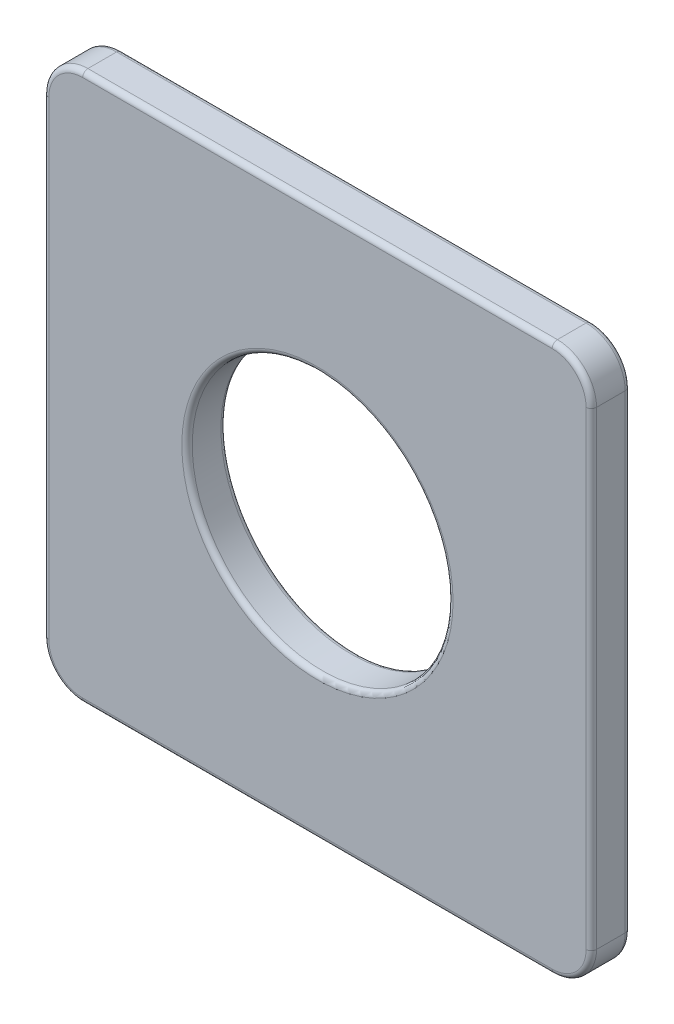
ISO-10303-21;
HEADER;
FILE_DESCRIPTION(('STEP AP214'),'2;1');
FILE_NAME('part.step','',(''),(''),'','','');
FILE_SCHEMA(('AUTOMOTIVE_DESIGN { 1 0 10303 214 1 1 1 1 }'));
ENDSEC;
DATA;
#1=APPLICATION_CONTEXT('core data for automotive mechanical design processes');
#2=APPLICATION_PROTOCOL_DEFINITION('international standard','automotive_design',2000,#1);
#3=PRODUCT_CONTEXT('',#1,'mechanical');
#4=PRODUCT('Part','Part','',(#3));
#5=PRODUCT_RELATED_PRODUCT_CATEGORY('part','',(#4));
#6=PRODUCT_DEFINITION_FORMATION('','',#4);
#7=PRODUCT_DEFINITION_CONTEXT('part definition',#1,'design');
#8=PRODUCT_DEFINITION('design','',#6,#7);
#9=PRODUCT_DEFINITION_SHAPE('','',#8);
#10=(LENGTH_UNIT() NAMED_UNIT(*) SI_UNIT(.MILLI.,.METRE.));
#11=(NAMED_UNIT(*) PLANE_ANGLE_UNIT() SI_UNIT($,.RADIAN.));
#12=(NAMED_UNIT(*) SI_UNIT($,.STERADIAN.) SOLID_ANGLE_UNIT());
#13=UNCERTAINTY_MEASURE_WITH_UNIT(LENGTH_MEASURE(1.E-05),#10,'distance_accuracy_value','');
#14=(GEOMETRIC_REPRESENTATION_CONTEXT(3) GLOBAL_UNCERTAINTY_ASSIGNED_CONTEXT((#13)) GLOBAL_UNIT_ASSIGNED_CONTEXT((#10,
#11,#12)) REPRESENTATION_CONTEXT('',''));
#15=CARTESIAN_POINT('',(0.,0.,0.));
#16=DIRECTION('',(0.,0.,1.));
#17=DIRECTION('',(1.,0.,0.));
#18=AXIS2_PLACEMENT_3D('',#15,#16,#17);
#19=CARTESIAN_POINT('',(-10.5,-10.5,0.75));
#20=DIRECTION('',(1.,0.,0.));
#21=DIRECTION('',(0.,0.,-1.));
#22=AXIS2_PLACEMENT_3D('',#19,#20,#21);
#23=PLANE('',#22);
#24=DIRECTION('',(0.,0.,-1.));
#25=VECTOR('',#24,1.);
#26=CARTESIAN_POINT('',(-10.5,-9.,0.75));
#27=LINE('',#26,#25);
#28=CARTESIAN_POINT('',(-10.5,-9.,-0.55));
#29=VERTEX_POINT('',#28);
#30=CARTESIAN_POINT('',(-10.5,-9.,0.55));
#31=VERTEX_POINT('',#30);
#32=EDGE_CURVE('E252',#29,#31,#27,.F.);
#33=ORIENTED_EDGE('',*,*,#32,.T.);
#34=DIRECTION('',(0.,-1.,0.));
#35=VECTOR('',#34,1.);
#36=CARTESIAN_POINT('',(-10.5,8.99999999999999,0.55));
#37=LINE('',#36,#35);
#38=CARTESIAN_POINT('',(-10.5,9.,0.55));
#39=VERTEX_POINT('',#38);
#40=EDGE_CURVE('E204',#31,#39,#37,.F.);
#41=ORIENTED_EDGE('',*,*,#40,.T.);
#42=DIRECTION('',(0.,0.,-1.));
#43=VECTOR('',#42,1.);
#44=CARTESIAN_POINT('',(-10.5,9.,0.75));
#45=LINE('',#44,#43);
#46=CARTESIAN_POINT('',(-10.5,9.,-0.55));
#47=VERTEX_POINT('',#46);
#48=EDGE_CURVE('E298',#39,#47,#45,.T.);
#49=ORIENTED_EDGE('',*,*,#48,.T.);
#50=DIRECTION('',(0.,-1.,0.));
#51=VECTOR('',#50,1.);
#52=CARTESIAN_POINT('',(-10.5,-10.5,-0.55));
#53=LINE('',#52,#51);
#54=EDGE_CURVE('E202',#47,#29,#53,.T.);
#55=ORIENTED_EDGE('',*,*,#54,.T.);
#56=EDGE_LOOP('',(#33,#41,#49,#55));
#57=FACE_BOUND('',#56,.T.);
#58=ADVANCED_FACE('F37',(#57),#23,.F.);
#59=CARTESIAN_POINT('',(10.5,-10.5,0.75));
#60=DIRECTION('',(0.,1.,0.));
#61=DIRECTION('',(-1.,0.,0.));
#62=AXIS2_PLACEMENT_3D('',#59,#60,#61);
#63=PLANE('',#62);
#64=DIRECTION('',(0.,0.,-1.));
#65=VECTOR('',#64,1.);
#66=CARTESIAN_POINT('',(9.,-10.5,0.75));
#67=LINE('',#66,#65);
#68=CARTESIAN_POINT('',(9.,-10.5,-0.55));
#69=VERTEX_POINT('',#68);
#70=CARTESIAN_POINT('',(9.,-10.5,0.55));
#71=VERTEX_POINT('',#70);
#72=EDGE_CURVE('E312',#69,#71,#67,.F.);
#73=ORIENTED_EDGE('',*,*,#72,.T.);
#74=DIRECTION('',(1.,0.,0.));
#75=VECTOR('',#74,1.);
#76=CARTESIAN_POINT('',(-9.,-10.5,0.55));
#77=LINE('',#76,#75);
#78=CARTESIAN_POINT('',(-9.,-10.5,0.55));
#79=VERTEX_POINT('',#78);
#80=EDGE_CURVE('E195',#71,#79,#77,.F.);
#81=ORIENTED_EDGE('',*,*,#80,.T.);
#82=DIRECTION('',(0.,0.,-1.));
#83=VECTOR('',#82,1.);
#84=CARTESIAN_POINT('',(-9.,-10.5,0.75));
#85=LINE('',#84,#83);
#86=CARTESIAN_POINT('',(-9.,-10.5,-0.55));
#87=VERTEX_POINT('',#86);
#88=EDGE_CURVE('E309',#79,#87,#85,.T.);
#89=ORIENTED_EDGE('',*,*,#88,.T.);
#90=DIRECTION('',(1.,0.,0.));
#91=VECTOR('',#90,1.);
#92=CARTESIAN_POINT('',(10.5,-10.5,-0.55));
#93=LINE('',#92,#91);
#94=EDGE_CURVE('E193',#87,#69,#93,.T.);
#95=ORIENTED_EDGE('',*,*,#94,.T.);
#96=EDGE_LOOP('',(#73,#81,#89,#95));
#97=FACE_BOUND('',#96,.T.);
#98=ADVANCED_FACE('F380',(#97),#63,.F.);
#99=CARTESIAN_POINT('',(10.5,-10.5,0.75));
#100=DIRECTION('',(-1.,0.,0.));
#101=DIRECTION('',(0.,0.,1.));
#102=AXIS2_PLACEMENT_3D('',#99,#100,#101);
#103=PLANE('',#102);
#104=DIRECTION('',(0.,0.,-1.));
#105=VECTOR('',#104,1.);
#106=CARTESIAN_POINT('',(10.5,9.00000000000001,0.75));
#107=LINE('',#106,#105);
#108=CARTESIAN_POINT('',(10.5,9.00000000000001,-0.55));
#109=VERTEX_POINT('',#108);
#110=CARTESIAN_POINT('',(10.5,9.00000000000001,0.55));
#111=VERTEX_POINT('',#110);
#112=EDGE_CURVE('E292',#109,#111,#107,.F.);
#113=ORIENTED_EDGE('',*,*,#112,.T.);
#114=DIRECTION('',(0.,1.,0.));
#115=VECTOR('',#114,1.);
#116=CARTESIAN_POINT('',(10.5,-9.,0.55));
#117=LINE('',#116,#115);
#118=CARTESIAN_POINT('',(10.5,-9.,0.55));
#119=VERTEX_POINT('',#118);
#120=EDGE_CURVE('E187',#111,#119,#117,.F.);
#121=ORIENTED_EDGE('',*,*,#120,.T.);
#122=DIRECTION('',(0.,0.,-1.));
#123=VECTOR('',#122,1.);
#124=CARTESIAN_POINT('',(10.5,-9.,0.75));
#125=LINE('',#124,#123);
#126=CARTESIAN_POINT('',(10.5,-9.,-0.55));
#127=VERTEX_POINT('',#126);
#128=EDGE_CURVE('E306',#119,#127,#125,.T.);
#129=ORIENTED_EDGE('',*,*,#128,.T.);
#130=DIRECTION('',(0.,1.,0.));
#131=VECTOR('',#130,1.);
#132=CARTESIAN_POINT('',(10.5,-10.5,-0.55));
#133=LINE('',#132,#131);
#134=EDGE_CURVE('E185',#127,#109,#133,.T.);
#135=ORIENTED_EDGE('',*,*,#134,.T.);
#136=EDGE_LOOP('',(#113,#121,#129,#135));
#137=FACE_BOUND('',#136,.T.);
#138=ADVANCED_FACE('F335',(#137),#103,.F.);
#139=CARTESIAN_POINT('',(10.5,10.5,0.75));
#140=DIRECTION('',(0.,-1.,0.));
#141=DIRECTION('',(1.,0.,0.));
#142=AXIS2_PLACEMENT_3D('',#139,#140,#141);
#143=PLANE('',#142);
#144=DIRECTION('',(0.,0.,-1.));
#145=VECTOR('',#144,1.);
#146=CARTESIAN_POINT('',(-9.,10.5,0.75));
#147=LINE('',#146,#145);
#148=CARTESIAN_POINT('',(-9.,10.5,-0.55));
#149=VERTEX_POINT('',#148);
#150=CARTESIAN_POINT('',(-9.,10.5,0.55));
#151=VERTEX_POINT('',#150);
#152=EDGE_CURVE('E297',#149,#151,#147,.F.);
#153=ORIENTED_EDGE('',*,*,#152,.T.);
#154=DIRECTION('',(-1.,0.,0.));
#155=VECTOR('',#154,1.);
#156=CARTESIAN_POINT('',(9.,10.5,0.55));
#157=LINE('',#156,#155);
#158=CARTESIAN_POINT('',(9.,10.5,0.55));
#159=VERTEX_POINT('',#158);
#160=EDGE_CURVE('E212',#151,#159,#157,.F.);
#161=ORIENTED_EDGE('',*,*,#160,.T.);
#162=DIRECTION('',(0.,0.,-1.));
#163=VECTOR('',#162,1.);
#164=CARTESIAN_POINT('',(9.,10.5,0.75));
#165=LINE('',#164,#163);
#166=CARTESIAN_POINT('',(9.,10.5,-0.55));
#167=VERTEX_POINT('',#166);
#168=EDGE_CURVE('E290',#159,#167,#165,.T.);
#169=ORIENTED_EDGE('',*,*,#168,.T.);
#170=DIRECTION('',(-1.,0.,0.));
#171=VECTOR('',#170,1.);
#172=CARTESIAN_POINT('',(10.5,10.5,-0.55));
#173=LINE('',#172,#171);
#174=EDGE_CURVE('E210',#167,#149,#173,.T.);
#175=ORIENTED_EDGE('',*,*,#174,.T.);
#176=EDGE_LOOP('',(#153,#161,#169,#175));
#177=FACE_BOUND('',#176,.T.);
#178=ADVANCED_FACE('F295',(#177),#143,.F.);
#179=CARTESIAN_POINT('',(0.,0.,0.75));
#180=DIRECTION('',(0.,0.,1.));
#181=DIRECTION('',(1.,0.,0.));
#182=AXIS2_PLACEMENT_3D('',#179,#180,#181);
#183=PLANE('',#182);
#184=DIRECTION('',(0.,1.,0.));
#185=VECTOR('',#184,1.);
#186=CARTESIAN_POINT('',(10.3,9.,0.75));
#187=LINE('',#186,#185);
#188=CARTESIAN_POINT('',(10.3,-9.,0.75));
#189=VERTEX_POINT('',#188);
#190=CARTESIAN_POINT('',(10.3,9.00000000000001,0.75));
#191=VERTEX_POINT('',#190);
#192=EDGE_CURVE('E175',#189,#191,#187,.T.);
#193=ORIENTED_EDGE('',*,*,#192,.T.);
#194=CARTESIAN_POINT('',(9.,9.,0.75));
#195=DIRECTION('',(0.,0.,1.));
#196=DIRECTION('',(1.,0.,0.));
#197=AXIS2_PLACEMENT_3D('',#194,#195,#196);
#198=CIRCLE('',#197,1.3);
#199=CARTESIAN_POINT('',(9.,10.3,0.75));
#200=VERTEX_POINT('',#199);
#201=EDGE_CURVE('E155',#191,#200,#198,.T.);
#202=ORIENTED_EDGE('',*,*,#201,.T.);
#203=DIRECTION('',(-1.,0.,0.));
#204=VECTOR('',#203,1.);
#205=CARTESIAN_POINT('',(-9.,10.3,0.75));
#206=LINE('',#205,#204);
#207=CARTESIAN_POINT('',(-9.,10.3,0.75));
#208=VERTEX_POINT('',#207);
#209=EDGE_CURVE('E163',#200,#208,#206,.T.);
#210=ORIENTED_EDGE('',*,*,#209,.T.);
#211=CARTESIAN_POINT('',(-9.,9.,0.75));
#212=DIRECTION('',(0.,0.,1.));
#213=DIRECTION('',(1.,0.,0.));
#214=AXIS2_PLACEMENT_3D('',#211,#212,#213);
#215=CIRCLE('',#214,1.3);
#216=CARTESIAN_POINT('',(-10.3,9.,0.75));
#217=VERTEX_POINT('',#216);
#218=EDGE_CURVE('E169',#208,#217,#215,.T.);
#219=ORIENTED_EDGE('',*,*,#218,.T.);
#220=DIRECTION('',(0.,-1.,0.));
#221=VECTOR('',#220,1.);
#222=CARTESIAN_POINT('',(-10.3,-9.,0.75));
#223=LINE('',#222,#221);
#224=CARTESIAN_POINT('',(-10.3,-9.,0.75));
#225=VERTEX_POINT('',#224);
#226=EDGE_CURVE('E318',#217,#225,#223,.T.);
#227=ORIENTED_EDGE('',*,*,#226,.T.);
#228=CARTESIAN_POINT('',(-9.,-9.,0.75));
#229=DIRECTION('',(0.,0.,1.));
#230=DIRECTION('',(1.,0.,0.));
#231=AXIS2_PLACEMENT_3D('',#228,#229,#230);
#232=CIRCLE('',#231,1.3);
#233=CARTESIAN_POINT('',(-9.,-10.3,0.75));
#234=VERTEX_POINT('',#233);
#235=EDGE_CURVE('E320',#225,#234,#232,.T.);
#236=ORIENTED_EDGE('',*,*,#235,.T.);
#237=DIRECTION('',(1.,0.,0.));
#238=VECTOR('',#237,1.);
#239=CARTESIAN_POINT('',(9.,-10.3,0.75));
#240=LINE('',#239,#238);
#241=CARTESIAN_POINT('',(9.,-10.3,0.75));
#242=VERTEX_POINT('',#241);
#243=EDGE_CURVE('E322',#234,#242,#240,.T.);
#244=ORIENTED_EDGE('',*,*,#243,.T.);
#245=CARTESIAN_POINT('',(9.,-9.,0.75));
#246=DIRECTION('',(0.,0.,1.));
#247=DIRECTION('',(1.,0.,0.));
#248=AXIS2_PLACEMENT_3D('',#245,#246,#247);
#249=CIRCLE('',#248,1.3);
#250=EDGE_CURVE('E180',#242,#189,#249,.T.);
#251=ORIENTED_EDGE('',*,*,#250,.T.);
#252=EDGE_LOOP('',(#193,#202,#210,#219,#227,#236,#244,#251));
#253=FACE_BOUND('',#252,.T.);
#254=CARTESIAN_POINT('',(0.,0.,0.75));
#255=DIRECTION('',(0.,0.,1.));
#256=DIRECTION('',(1.,0.,0.));
#257=AXIS2_PLACEMENT_3D('',#254,#255,#256);
#258=CIRCLE('',#257,5.2);
#259=CARTESIAN_POINT('',(5.2,0.,0.75));
#260=VERTEX_POINT('',#259);
#261=EDGE_CURVE('E170',#260,#260,#258,.F.);
#262=ORIENTED_EDGE('',*,*,#261,.T.);
#263=EDGE_LOOP('',(#262));
#264=FACE_BOUND('',#263,.T.);
#265=ADVANCED_FACE('F172',(#253,#264),#183,.T.);
#266=CARTESIAN_POINT('',(0.,0.,-0.75));
#267=DIRECTION('',(0.,0.,1.));
#268=DIRECTION('',(1.,0.,0.));
#269=AXIS2_PLACEMENT_3D('',#266,#267,#268);
#270=PLANE('',#269);
#271=DIRECTION('',(1.,0.,0.));
#272=VECTOR('',#271,1.);
#273=CARTESIAN_POINT('',(0.,-10.3,-0.75));
#274=LINE('',#273,#272);
#275=CARTESIAN_POINT('',(9.,-10.3,-0.75));
#276=VERTEX_POINT('',#275);
#277=CARTESIAN_POINT('',(-9.,-10.3,-0.75));
#278=VERTEX_POINT('',#277);
#279=EDGE_CURVE('E46',#276,#278,#274,.F.);
#280=ORIENTED_EDGE('',*,*,#279,.T.);
#281=CARTESIAN_POINT('',(-9.,-9.,-0.75));
#282=DIRECTION('',(0.,0.,1.));
#283=DIRECTION('',(1.,0.,0.));
#284=AXIS2_PLACEMENT_3D('',#281,#282,#283);
#285=CIRCLE('',#284,1.3);
#286=CARTESIAN_POINT('',(-10.3,-9.,-0.75));
#287=VERTEX_POINT('',#286);
#288=EDGE_CURVE('E11',#278,#287,#285,.F.);
#289=ORIENTED_EDGE('',*,*,#288,.T.);
#290=DIRECTION('',(0.,-1.,0.));
#291=VECTOR('',#290,1.);
#292=CARTESIAN_POINT('',(-10.3,0.,-0.75));
#293=LINE('',#292,#291);
#294=CARTESIAN_POINT('',(-10.3,9.,-0.75));
#295=VERTEX_POINT('',#294);
#296=EDGE_CURVE('E223',#287,#295,#293,.F.);
#297=ORIENTED_EDGE('',*,*,#296,.T.);
#298=CARTESIAN_POINT('',(-9.,9.,-0.75));
#299=DIRECTION('',(0.,0.,1.));
#300=DIRECTION('',(1.,0.,0.));
#301=AXIS2_PLACEMENT_3D('',#298,#299,#300);
#302=CIRCLE('',#301,1.3);
#303=CARTESIAN_POINT('',(-9.,10.3,-0.75));
#304=VERTEX_POINT('',#303);
#305=EDGE_CURVE('E225',#295,#304,#302,.F.);
#306=ORIENTED_EDGE('',*,*,#305,.T.);
#307=DIRECTION('',(-1.,0.,0.));
#308=VECTOR('',#307,1.);
#309=CARTESIAN_POINT('',(0.,10.3,-0.75));
#310=LINE('',#309,#308);
#311=CARTESIAN_POINT('',(9.,10.3,-0.75));
#312=VERTEX_POINT('',#311);
#313=EDGE_CURVE('E227',#304,#312,#310,.F.);
#314=ORIENTED_EDGE('',*,*,#313,.T.);
#315=CARTESIAN_POINT('',(9.,9.,-0.75));
#316=DIRECTION('',(0.,0.,1.));
#317=DIRECTION('',(1.,0.,0.));
#318=AXIS2_PLACEMENT_3D('',#315,#316,#317);
#319=CIRCLE('',#318,1.3);
#320=CARTESIAN_POINT('',(10.3,9.00000000000001,-0.75));
#321=VERTEX_POINT('',#320);
#322=EDGE_CURVE('E229',#312,#321,#319,.F.);
#323=ORIENTED_EDGE('',*,*,#322,.T.);
#324=DIRECTION('',(0.,1.,0.));
#325=VECTOR('',#324,1.);
#326=CARTESIAN_POINT('',(10.3,0.,-0.75));
#327=LINE('',#326,#325);
#328=CARTESIAN_POINT('',(10.3,-9.,-0.75));
#329=VERTEX_POINT('',#328);
#330=EDGE_CURVE('E231',#321,#329,#327,.F.);
#331=ORIENTED_EDGE('',*,*,#330,.T.);
#332=CARTESIAN_POINT('',(9.,-9.,-0.75));
#333=DIRECTION('',(0.,0.,1.));
#334=DIRECTION('',(1.,0.,0.));
#335=AXIS2_PLACEMENT_3D('',#332,#333,#334);
#336=CIRCLE('',#335,1.3);
#337=EDGE_CURVE('E57',#329,#276,#336,.F.);
#338=ORIENTED_EDGE('',*,*,#337,.T.);
#339=EDGE_LOOP('',(#280,#289,#297,#306,#314,#323,#331,#338));
#340=FACE_BOUND('',#339,.T.);
#341=CARTESIAN_POINT('',(0.,0.,-0.75));
#342=DIRECTION('',(0.,0.,1.));
#343=DIRECTION('',(1.,0.,0.));
#344=AXIS2_PLACEMENT_3D('',#341,#342,#343);
#345=CIRCLE('',#344,5.2);
#346=CARTESIAN_POINT('',(5.2,0.,-0.75));
#347=VERTEX_POINT('',#346);
#348=EDGE_CURVE('E220',#347,#347,#345,.T.);
#349=ORIENTED_EDGE('',*,*,#348,.T.);
#350=EDGE_LOOP('',(#349));
#351=FACE_BOUND('',#350,.T.);
#352=ADVANCED_FACE('F351',(#340,#351),#270,.F.);
#353=CARTESIAN_POINT('',(-9.,9.,0.75));
#354=DIRECTION('',(0.,0.,-1.));
#355=DIRECTION('',(-1.,0.,0.));
#356=AXIS2_PLACEMENT_3D('',#353,#354,#355);
#357=CYLINDRICAL_SURFACE('',#356,1.5);
#358=ORIENTED_EDGE('',*,*,#48,.F.);
#359=CARTESIAN_POINT('',(-9.,9.,0.55));
#360=DIRECTION('',(0.,0.,1.));
#361=DIRECTION('',(1.,0.,0.));
#362=AXIS2_PLACEMENT_3D('',#359,#360,#361);
#363=CIRCLE('',#362,1.5);
#364=EDGE_CURVE('E208',#39,#151,#363,.F.);
#365=ORIENTED_EDGE('',*,*,#364,.T.);
#366=ORIENTED_EDGE('',*,*,#152,.F.);
#367=CARTESIAN_POINT('',(-9.,9.,-0.55));
#368=DIRECTION('',(0.,0.,1.));
#369=DIRECTION('',(1.,0.,0.));
#370=AXIS2_PLACEMENT_3D('',#367,#368,#369);
#371=CIRCLE('',#370,1.5);
#372=EDGE_CURVE('E206',#149,#47,#371,.T.);
#373=ORIENTED_EDGE('',*,*,#372,.T.);
#374=EDGE_LOOP('',(#358,#365,#366,#373));
#375=FACE_BOUND('',#374,.T.);
#376=ADVANCED_FACE('F391',(#375),#357,.T.);
#377=CARTESIAN_POINT('',(9.,-9.,0.75));
#378=DIRECTION('',(0.,0.,-1.));
#379=DIRECTION('',(-1.,0.,0.));
#380=AXIS2_PLACEMENT_3D('',#377,#378,#379);
#381=CYLINDRICAL_SURFACE('',#380,1.5);
#382=ORIENTED_EDGE('',*,*,#128,.F.);
#383=CARTESIAN_POINT('',(9.,-9.,0.55));
#384=DIRECTION('',(0.,0.,1.));
#385=DIRECTION('',(1.,0.,0.));
#386=AXIS2_PLACEMENT_3D('',#383,#384,#385);
#387=CIRCLE('',#386,1.5);
#388=EDGE_CURVE('E191',#119,#71,#387,.F.);
#389=ORIENTED_EDGE('',*,*,#388,.T.);
#390=ORIENTED_EDGE('',*,*,#72,.F.);
#391=CARTESIAN_POINT('',(9.,-9.,-0.55));
#392=DIRECTION('',(0.,0.,1.));
#393=DIRECTION('',(1.,0.,0.));
#394=AXIS2_PLACEMENT_3D('',#391,#392,#393);
#395=CIRCLE('',#394,1.5);
#396=EDGE_CURVE('E189',#69,#127,#395,.T.);
#397=ORIENTED_EDGE('',*,*,#396,.T.);
#398=EDGE_LOOP('',(#382,#389,#390,#397));
#399=FACE_BOUND('',#398,.T.);
#400=ADVANCED_FACE('F337',(#399),#381,.T.);
#401=CARTESIAN_POINT('',(-9.,-9.,0.75));
#402=DIRECTION('',(0.,0.,-1.));
#403=DIRECTION('',(-1.,0.,0.));
#404=AXIS2_PLACEMENT_3D('',#401,#402,#403);
#405=CYLINDRICAL_SURFACE('',#404,1.5);
#406=ORIENTED_EDGE('',*,*,#88,.F.);
#407=CARTESIAN_POINT('',(-9.,-9.,0.55));
#408=DIRECTION('',(0.,0.,1.));
#409=DIRECTION('',(1.,0.,0.));
#410=AXIS2_PLACEMENT_3D('',#407,#408,#409);
#411=CIRCLE('',#410,1.5);
#412=EDGE_CURVE('E200',#79,#31,#411,.F.);
#413=ORIENTED_EDGE('',*,*,#412,.T.);
#414=ORIENTED_EDGE('',*,*,#32,.F.);
#415=CARTESIAN_POINT('',(-9.,-9.,-0.55));
#416=DIRECTION('',(0.,0.,1.));
#417=DIRECTION('',(1.,0.,0.));
#418=AXIS2_PLACEMENT_3D('',#415,#416,#417);
#419=CIRCLE('',#418,1.5);
#420=EDGE_CURVE('E197',#29,#87,#419,.T.);
#421=ORIENTED_EDGE('',*,*,#420,.T.);
#422=EDGE_LOOP('',(#406,#413,#414,#421));
#423=FACE_BOUND('',#422,.T.);
#424=ADVANCED_FACE('F369',(#423),#405,.T.);
#425=CARTESIAN_POINT('',(9.,9.,0.75));
#426=DIRECTION('',(0.,0.,-1.));
#427=DIRECTION('',(-1.,0.,0.));
#428=AXIS2_PLACEMENT_3D('',#425,#426,#427);
#429=CYLINDRICAL_SURFACE('',#428,1.5);
#430=ORIENTED_EDGE('',*,*,#168,.F.);
#431=CARTESIAN_POINT('',(9.,9.,0.55));
#432=DIRECTION('',(0.,0.,1.));
#433=DIRECTION('',(1.,0.,0.));
#434=AXIS2_PLACEMENT_3D('',#431,#432,#433);
#435=CIRCLE('',#434,1.5);
#436=EDGE_CURVE('E157',#159,#111,#435,.F.);
#437=ORIENTED_EDGE('',*,*,#436,.T.);
#438=ORIENTED_EDGE('',*,*,#112,.F.);
#439=CARTESIAN_POINT('',(9.,9.,-0.55));
#440=DIRECTION('',(0.,0.,1.));
#441=DIRECTION('',(1.,0.,0.));
#442=AXIS2_PLACEMENT_3D('',#439,#440,#441);
#443=CIRCLE('',#442,1.5);
#444=EDGE_CURVE('E177',#109,#167,#443,.T.);
#445=ORIENTED_EDGE('',*,*,#444,.T.);
#446=EDGE_LOOP('',(#430,#437,#438,#445));
#447=FACE_BOUND('',#446,.T.);
#448=ADVANCED_FACE('F289',(#447),#429,.T.);
#449=CARTESIAN_POINT('',(0.,0.,0.75));
#450=DIRECTION('',(0.,0.,-1.));
#451=DIRECTION('',(-1.,0.,0.));
#452=AXIS2_PLACEMENT_3D('',#449,#450,#451);
#453=CYLINDRICAL_SURFACE('',#452,5.);
#454=CARTESIAN_POINT('',(0.,0.,0.55));
#455=DIRECTION('',(0.,0.,1.));
#456=DIRECTION('',(1.,0.,0.));
#457=AXIS2_PLACEMENT_3D('',#454,#455,#456);
#458=CIRCLE('',#457,5.);
#459=CARTESIAN_POINT('',(5.,0.,0.55));
#460=VERTEX_POINT('',#459);
#461=EDGE_CURVE('E217',#460,#460,#458,.T.);
#462=ORIENTED_EDGE('',*,*,#461,.T.);
#463=EDGE_LOOP('',(#462));
#464=FACE_BOUND('',#463,.T.);
#465=CARTESIAN_POINT('',(0.,0.,-0.55));
#466=DIRECTION('',(0.,0.,1.));
#467=DIRECTION('',(1.,0.,0.));
#468=AXIS2_PLACEMENT_3D('',#465,#466,#467);
#469=CIRCLE('',#468,5.);
#470=CARTESIAN_POINT('',(5.,0.,-0.55));
#471=VERTEX_POINT('',#470);
#472=EDGE_CURVE('E214',#471,#471,#469,.F.);
#473=ORIENTED_EDGE('',*,*,#472,.T.);
#474=EDGE_LOOP('',(#473));
#475=FACE_BOUND('',#474,.T.);
#476=ADVANCED_FACE('F401',(#464,#475),#453,.F.);
#477=CARTESIAN_POINT('',(-9.,-9.,0.55));
#478=DIRECTION('',(0.,0.,1.));
#479=DIRECTION('',(1.,0.,0.));
#480=AXIS2_PLACEMENT_3D('',#477,#478,#479);
#481=TOROIDAL_SURFACE('',#480,1.3,0.2);
#482=CARTESIAN_POINT('',(-10.3,-9.,0.55));
#483=DIRECTION('',(0.,1.,0.));
#484=DIRECTION('',(0.,0.,1.));
#485=AXIS2_PLACEMENT_3D('',#482,#483,#484);
#486=CIRCLE('',#485,0.2);
#487=EDGE_CURVE('E246',#31,#225,#486,.T.);
#488=ORIENTED_EDGE('',*,*,#487,.F.);
#489=ORIENTED_EDGE('',*,*,#412,.F.);
#490=CARTESIAN_POINT('',(-9.,-10.3,0.55));
#491=DIRECTION('',(1.,0.,0.));
#492=DIRECTION('',(0.,0.,-1.));
#493=AXIS2_PLACEMENT_3D('',#490,#491,#492);
#494=CIRCLE('',#493,0.2);
#495=EDGE_CURVE('E249',#234,#79,#494,.T.);
#496=ORIENTED_EDGE('',*,*,#495,.F.);
#497=ORIENTED_EDGE('',*,*,#235,.F.);
#498=EDGE_LOOP('',(#488,#489,#496,#497));
#499=FACE_BOUND('',#498,.T.);
#500=ADVANCED_FACE('F373',(#499),#481,.T.);
#501=CARTESIAN_POINT('',(0.,-10.3,0.55));
#502=DIRECTION('',(-1.,0.,0.));
#503=DIRECTION('',(0.,-1.,0.));
#504=AXIS2_PLACEMENT_3D('',#501,#502,#503);
#505=CYLINDRICAL_SURFACE('',#504,0.2);
#506=ORIENTED_EDGE('',*,*,#495,.T.);
#507=ORIENTED_EDGE('',*,*,#80,.F.);
#508=CARTESIAN_POINT('',(9.,-10.3,0.55));
#509=DIRECTION('',(1.,0.,0.));
#510=DIRECTION('',(0.,0.,-1.));
#511=AXIS2_PLACEMENT_3D('',#508,#509,#510);
#512=CIRCLE('',#511,0.2);
#513=EDGE_CURVE('E243',#242,#71,#512,.T.);
#514=ORIENTED_EDGE('',*,*,#513,.F.);
#515=ORIENTED_EDGE('',*,*,#243,.F.);
#516=EDGE_LOOP('',(#506,#507,#514,#515));
#517=FACE_BOUND('',#516,.T.);
#518=ADVANCED_FACE('F378',(#517),#505,.T.);
#519=CARTESIAN_POINT('',(-10.3,0.,0.55));
#520=DIRECTION('',(0.,1.,0.));
#521=DIRECTION('',(0.,0.,1.));
#522=AXIS2_PLACEMENT_3D('',#519,#520,#521);
#523=CYLINDRICAL_SURFACE('',#522,0.2);
#524=ORIENTED_EDGE('',*,*,#487,.T.);
#525=ORIENTED_EDGE('',*,*,#226,.F.);
#526=CARTESIAN_POINT('',(-10.3,9.,0.55));
#527=DIRECTION('',(0.,1.,0.));
#528=DIRECTION('',(0.,0.,1.));
#529=AXIS2_PLACEMENT_3D('',#526,#527,#528);
#530=CIRCLE('',#529,0.2);
#531=EDGE_CURVE('E240',#39,#217,#530,.T.);
#532=ORIENTED_EDGE('',*,*,#531,.F.);
#533=ORIENTED_EDGE('',*,*,#40,.F.);
#534=EDGE_LOOP('',(#524,#525,#532,#533));
#535=FACE_BOUND('',#534,.T.);
#536=ADVANCED_FACE('F415',(#535),#523,.T.);
#537=CARTESIAN_POINT('',(9.,-9.,0.55));
#538=DIRECTION('',(0.,0.,1.));
#539=DIRECTION('',(1.,0.,0.));
#540=AXIS2_PLACEMENT_3D('',#537,#538,#539);
#541=TOROIDAL_SURFACE('',#540,1.3,0.2);
#542=ORIENTED_EDGE('',*,*,#513,.T.);
#543=ORIENTED_EDGE('',*,*,#388,.F.);
#544=CARTESIAN_POINT('',(10.3,-9.,0.55));
#545=DIRECTION('',(0.,1.,0.));
#546=DIRECTION('',(0.,0.,1.));
#547=AXIS2_PLACEMENT_3D('',#544,#545,#546);
#548=CIRCLE('',#547,0.2);
#549=EDGE_CURVE('E237',#189,#119,#548,.T.);
#550=ORIENTED_EDGE('',*,*,#549,.F.);
#551=ORIENTED_EDGE('',*,*,#250,.F.);
#552=EDGE_LOOP('',(#542,#543,#550,#551));
#553=FACE_BOUND('',#552,.T.);
#554=ADVANCED_FACE('F329',(#553),#541,.T.);
#555=CARTESIAN_POINT('',(-9.,9.,0.55));
#556=DIRECTION('',(0.,0.,1.));
#557=DIRECTION('',(1.,0.,0.));
#558=AXIS2_PLACEMENT_3D('',#555,#556,#557);
#559=TOROIDAL_SURFACE('',#558,1.3,0.2);
#560=ORIENTED_EDGE('',*,*,#531,.T.);
#561=ORIENTED_EDGE('',*,*,#218,.F.);
#562=CARTESIAN_POINT('',(-9.,10.3,0.55));
#563=DIRECTION('',(1.,0.,0.));
#564=DIRECTION('',(0.,0.,-1.));
#565=AXIS2_PLACEMENT_3D('',#562,#563,#564);
#566=CIRCLE('',#565,0.2);
#567=EDGE_CURVE('E166',#151,#208,#566,.T.);
#568=ORIENTED_EDGE('',*,*,#567,.F.);
#569=ORIENTED_EDGE('',*,*,#364,.F.);
#570=EDGE_LOOP('',(#560,#561,#568,#569));
#571=FACE_BOUND('',#570,.T.);
#572=ADVANCED_FACE('F409',(#571),#559,.T.);
#573=CARTESIAN_POINT('',(10.3,0.,0.55));
#574=DIRECTION('',(0.,-1.,0.));
#575=DIRECTION('',(0.,0.,-1.));
#576=AXIS2_PLACEMENT_3D('',#573,#574,#575);
#577=CYLINDRICAL_SURFACE('',#576,0.2);
#578=ORIENTED_EDGE('',*,*,#549,.T.);
#579=ORIENTED_EDGE('',*,*,#120,.F.);
#580=CARTESIAN_POINT('',(10.3,9.00000000000001,0.55));
#581=DIRECTION('',(0.,1.,0.));
#582=DIRECTION('',(0.,0.,1.));
#583=AXIS2_PLACEMENT_3D('',#580,#581,#582);
#584=CIRCLE('',#583,0.2);
#585=EDGE_CURVE('E160',#191,#111,#584,.T.);
#586=ORIENTED_EDGE('',*,*,#585,.F.);
#587=ORIENTED_EDGE('',*,*,#192,.F.);
#588=EDGE_LOOP('',(#578,#579,#586,#587));
#589=FACE_BOUND('',#588,.T.);
#590=ADVANCED_FACE('F332',(#589),#577,.T.);
#591=CARTESIAN_POINT('',(0.,10.3,0.55));
#592=DIRECTION('',(1.,0.,0.));
#593=DIRECTION('',(0.,1.,0.));
#594=AXIS2_PLACEMENT_3D('',#591,#592,#593);
#595=CYLINDRICAL_SURFACE('',#594,0.2);
#596=ORIENTED_EDGE('',*,*,#567,.T.);
#597=ORIENTED_EDGE('',*,*,#209,.F.);
#598=CARTESIAN_POINT('',(9.,10.3,0.55));
#599=DIRECTION('',(1.,0.,0.));
#600=DIRECTION('',(0.,0.,-1.));
#601=AXIS2_PLACEMENT_3D('',#598,#599,#600);
#602=CIRCLE('',#601,0.2);
#603=EDGE_CURVE('E151',#159,#200,#602,.T.);
#604=ORIENTED_EDGE('',*,*,#603,.F.);
#605=ORIENTED_EDGE('',*,*,#160,.F.);
#606=EDGE_LOOP('',(#596,#597,#604,#605));
#607=FACE_BOUND('',#606,.T.);
#608=ADVANCED_FACE('F164',(#607),#595,.T.);
#609=CARTESIAN_POINT('',(9.,9.,0.55));
#610=DIRECTION('',(0.,0.,1.));
#611=DIRECTION('',(1.,0.,0.));
#612=AXIS2_PLACEMENT_3D('',#609,#610,#611);
#613=TOROIDAL_SURFACE('',#612,1.3,0.2);
#614=ORIENTED_EDGE('',*,*,#585,.T.);
#615=ORIENTED_EDGE('',*,*,#436,.F.);
#616=ORIENTED_EDGE('',*,*,#603,.T.);
#617=ORIENTED_EDGE('',*,*,#201,.F.);
#618=EDGE_LOOP('',(#614,#615,#616,#617));
#619=FACE_BOUND('',#618,.T.);
#620=ADVANCED_FACE('F153',(#619),#613,.T.);
#621=CARTESIAN_POINT('',(0.,0.,0.55));
#622=DIRECTION('',(0.,0.,1.));
#623=DIRECTION('',(1.,0.,0.));
#624=AXIS2_PLACEMENT_3D('',#621,#622,#623);
#625=TOROIDAL_SURFACE('',#624,5.2,0.2);
#626=ORIENTED_EDGE('',*,*,#461,.F.);
#627=EDGE_LOOP('',(#626));
#628=FACE_BOUND('',#627,.T.);
#629=ORIENTED_EDGE('',*,*,#261,.F.);
#630=EDGE_LOOP('',(#629));
#631=FACE_BOUND('',#630,.T.);
#632=ADVANCED_FACE('F404',(#628,#631),#625,.T.);
#633=CARTESIAN_POINT('',(9.,9.,-0.55));
#634=DIRECTION('',(0.,0.,1.));
#635=DIRECTION('',(1.,0.,0.));
#636=AXIS2_PLACEMENT_3D('',#633,#634,#635);
#637=TOROIDAL_SURFACE('',#636,1.3,0.2);
#638=CARTESIAN_POINT('',(9.,10.3,-0.55));
#639=DIRECTION('',(-1.,0.,0.));
#640=DIRECTION('',(0.,0.,1.));
#641=AXIS2_PLACEMENT_3D('',#638,#639,#640);
#642=CIRCLE('',#641,0.2);
#643=EDGE_CURVE('E268',#167,#312,#642,.T.);
#644=ORIENTED_EDGE('',*,*,#643,.F.);
#645=ORIENTED_EDGE('',*,*,#444,.F.);
#646=CARTESIAN_POINT('',(10.3,9.00000000000001,-0.55));
#647=DIRECTION('',(0.,-1.,0.));
#648=DIRECTION('',(0.,0.,-1.));
#649=AXIS2_PLACEMENT_3D('',#646,#647,#648);
#650=CIRCLE('',#649,0.2);
#651=EDGE_CURVE('E41',#321,#109,#650,.T.);
#652=ORIENTED_EDGE('',*,*,#651,.F.);
#653=ORIENTED_EDGE('',*,*,#322,.F.);
#654=EDGE_LOOP('',(#644,#645,#652,#653));
#655=FACE_BOUND('',#654,.T.);
#656=ADVANCED_FACE('F284',(#655),#637,.T.);
#657=CARTESIAN_POINT('',(10.3,-10.5,-0.55));
#658=DIRECTION('',(0.,1.,0.));
#659=DIRECTION('',(0.,0.,1.));
#660=AXIS2_PLACEMENT_3D('',#657,#658,#659);
#661=CYLINDRICAL_SURFACE('',#660,0.2);
#662=ORIENTED_EDGE('',*,*,#651,.T.);
#663=ORIENTED_EDGE('',*,*,#134,.F.);
#664=CARTESIAN_POINT('',(10.3,-9.,-0.55));
#665=DIRECTION('',(0.,-1.,0.));
#666=DIRECTION('',(0.,0.,-1.));
#667=AXIS2_PLACEMENT_3D('',#664,#665,#666);
#668=CIRCLE('',#667,0.2);
#669=EDGE_CURVE('E266',#329,#127,#668,.T.);
#670=ORIENTED_EDGE('',*,*,#669,.F.);
#671=ORIENTED_EDGE('',*,*,#330,.F.);
#672=EDGE_LOOP('',(#662,#663,#670,#671));
#673=FACE_BOUND('',#672,.T.);
#674=ADVANCED_FACE('F279',(#673),#661,.T.);
#675=CARTESIAN_POINT('',(10.5,10.3,-0.55));
#676=DIRECTION('',(-1.,0.,0.));
#677=DIRECTION('',(0.,-1.,0.));
#678=AXIS2_PLACEMENT_3D('',#675,#676,#677);
#679=CYLINDRICAL_SURFACE('',#678,0.2);
#680=ORIENTED_EDGE('',*,*,#643,.T.);
#681=ORIENTED_EDGE('',*,*,#313,.F.);
#682=CARTESIAN_POINT('',(-9.,10.3,-0.55));
#683=DIRECTION('',(-1.,0.,0.));
#684=DIRECTION('',(0.,0.,1.));
#685=AXIS2_PLACEMENT_3D('',#682,#683,#684);
#686=CIRCLE('',#685,0.2);
#687=EDGE_CURVE('E263',#149,#304,#686,.T.);
#688=ORIENTED_EDGE('',*,*,#687,.F.);
#689=ORIENTED_EDGE('',*,*,#174,.F.);
#690=EDGE_LOOP('',(#680,#681,#688,#689));
#691=FACE_BOUND('',#690,.T.);
#692=ADVANCED_FACE('F436',(#691),#679,.T.);
#693=CARTESIAN_POINT('',(9.,-9.,-0.55));
#694=DIRECTION('',(0.,0.,1.));
#695=DIRECTION('',(1.,0.,0.));
#696=AXIS2_PLACEMENT_3D('',#693,#694,#695);
#697=TOROIDAL_SURFACE('',#696,1.3,0.2);
#698=ORIENTED_EDGE('',*,*,#669,.T.);
#699=ORIENTED_EDGE('',*,*,#396,.F.);
#700=CARTESIAN_POINT('',(9.,-10.3,-0.55));
#701=DIRECTION('',(-1.,0.,0.));
#702=DIRECTION('',(0.,0.,1.));
#703=AXIS2_PLACEMENT_3D('',#700,#701,#702);
#704=CIRCLE('',#703,0.2);
#705=EDGE_CURVE('E260',#276,#69,#704,.T.);
#706=ORIENTED_EDGE('',*,*,#705,.F.);
#707=ORIENTED_EDGE('',*,*,#337,.F.);
#708=EDGE_LOOP('',(#698,#699,#706,#707));
#709=FACE_BOUND('',#708,.T.);
#710=ADVANCED_FACE('F341',(#709),#697,.T.);
#711=CARTESIAN_POINT('',(-9.,9.,-0.55));
#712=DIRECTION('',(0.,0.,1.));
#713=DIRECTION('',(1.,0.,0.));
#714=AXIS2_PLACEMENT_3D('',#711,#712,#713);
#715=TOROIDAL_SURFACE('',#714,1.3,0.2);
#716=ORIENTED_EDGE('',*,*,#687,.T.);
#717=ORIENTED_EDGE('',*,*,#305,.F.);
#718=CARTESIAN_POINT('',(-10.3,9.,-0.55));
#719=DIRECTION('',(0.,-1.,0.));
#720=DIRECTION('',(0.,0.,-1.));
#721=AXIS2_PLACEMENT_3D('',#718,#719,#720);
#722=CIRCLE('',#721,0.2);
#723=EDGE_CURVE('E257',#47,#295,#722,.T.);
#724=ORIENTED_EDGE('',*,*,#723,.F.);
#725=ORIENTED_EDGE('',*,*,#372,.F.);
#726=EDGE_LOOP('',(#716,#717,#724,#725));
#727=FACE_BOUND('',#726,.T.);
#728=ADVANCED_FACE('F357',(#727),#715,.T.);
#729=CARTESIAN_POINT('',(10.5,-10.3,-0.55));
#730=DIRECTION('',(1.,0.,0.));
#731=DIRECTION('',(0.,1.,0.));
#732=AXIS2_PLACEMENT_3D('',#729,#730,#731);
#733=CYLINDRICAL_SURFACE('',#732,0.2);
#734=ORIENTED_EDGE('',*,*,#705,.T.);
#735=ORIENTED_EDGE('',*,*,#94,.F.);
#736=CARTESIAN_POINT('',(-9.,-10.3,-0.55));
#737=DIRECTION('',(-1.,0.,0.));
#738=DIRECTION('',(0.,0.,1.));
#739=AXIS2_PLACEMENT_3D('',#736,#737,#738);
#740=CIRCLE('',#739,0.2);
#741=EDGE_CURVE('E255',#278,#87,#740,.T.);
#742=ORIENTED_EDGE('',*,*,#741,.F.);
#743=ORIENTED_EDGE('',*,*,#279,.F.);
#744=EDGE_LOOP('',(#734,#735,#742,#743));
#745=FACE_BOUND('',#744,.T.);
#746=ADVANCED_FACE('F344',(#745),#733,.T.);
#747=CARTESIAN_POINT('',(-10.3,-10.5,-0.55));
#748=DIRECTION('',(0.,-1.,0.));
#749=DIRECTION('',(0.,0.,-1.));
#750=AXIS2_PLACEMENT_3D('',#747,#748,#749);
#751=CYLINDRICAL_SURFACE('',#750,0.2);
#752=ORIENTED_EDGE('',*,*,#723,.T.);
#753=ORIENTED_EDGE('',*,*,#296,.F.);
#754=CARTESIAN_POINT('',(-10.3,-9.,-0.55));
#755=DIRECTION('',(0.,-1.,0.));
#756=DIRECTION('',(0.,0.,-1.));
#757=AXIS2_PLACEMENT_3D('',#754,#755,#756);
#758=CIRCLE('',#757,0.2);
#759=EDGE_CURVE('E253',#29,#287,#758,.T.);
#760=ORIENTED_EDGE('',*,*,#759,.F.);
#761=ORIENTED_EDGE('',*,*,#54,.F.);
#762=EDGE_LOOP('',(#752,#753,#760,#761));
#763=FACE_BOUND('',#762,.T.);
#764=ADVANCED_FACE('F361',(#763),#751,.T.);
#765=CARTESIAN_POINT('',(-9.,-9.,-0.55));
#766=DIRECTION('',(0.,0.,1.));
#767=DIRECTION('',(1.,0.,0.));
#768=AXIS2_PLACEMENT_3D('',#765,#766,#767);
#769=TOROIDAL_SURFACE('',#768,1.3,0.2);
#770=ORIENTED_EDGE('',*,*,#741,.T.);
#771=ORIENTED_EDGE('',*,*,#420,.F.);
#772=ORIENTED_EDGE('',*,*,#759,.T.);
#773=ORIENTED_EDGE('',*,*,#288,.F.);
#774=EDGE_LOOP('',(#770,#771,#772,#773));
#775=FACE_BOUND('',#774,.T.);
#776=ADVANCED_FACE('F348',(#775),#769,.T.);
#777=CARTESIAN_POINT('',(0.,0.,-0.55));
#778=DIRECTION('',(0.,0.,1.));
#779=DIRECTION('',(1.,0.,0.));
#780=AXIS2_PLACEMENT_3D('',#777,#778,#779);
#781=TOROIDAL_SURFACE('',#780,5.2,0.2);
#782=ORIENTED_EDGE('',*,*,#348,.F.);
#783=EDGE_LOOP('',(#782));
#784=FACE_BOUND('',#783,.T.);
#785=ORIENTED_EDGE('',*,*,#472,.F.);
#786=EDGE_LOOP('',(#785));
#787=FACE_BOUND('',#786,.T.);
#788=ADVANCED_FACE('F39',(#784,#787),#781,.T.);
#789=CLOSED_SHELL('',(#58,#98,#138,#178,#265,#352,#376,#400,#424,#448,#476,#500,#518,#536,#554,
#572,#590,#608,#620,#632,#656,#674,#692,#710,#728,#746,#764,#776,#788));
#790=MANIFOLD_SOLID_BREP('B2',#789);
#791=ADVANCED_BREP_SHAPE_REPRESENTATION('',(#18,#790),#14);
#792=SHAPE_DEFINITION_REPRESENTATION(#9,#791);
ENDSEC;
END-ISO-10303-21;
